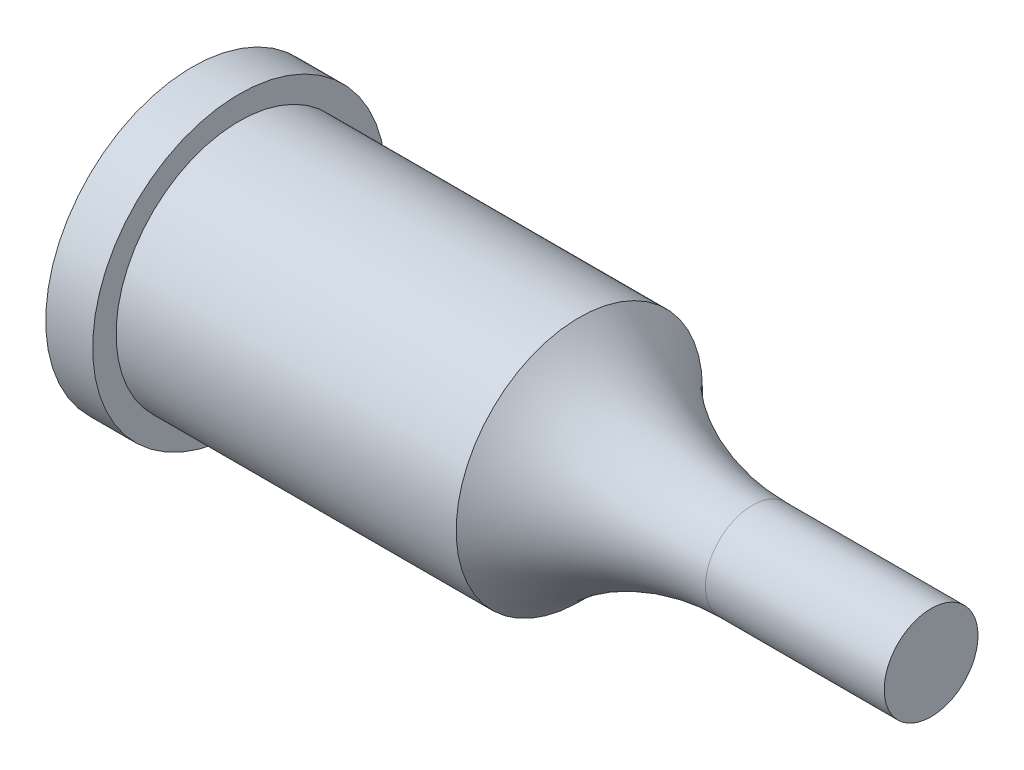
ISO-10303-21;
HEADER;
FILE_DESCRIPTION(('STEP AP214'),'2;1');
FILE_NAME('part.step','',(''),(''),'','','');
FILE_SCHEMA(('AUTOMOTIVE_DESIGN { 1 0 10303 214 1 1 1 1 }'));
ENDSEC;
DATA;
#1=APPLICATION_CONTEXT('core data for automotive mechanical design processes');
#2=APPLICATION_PROTOCOL_DEFINITION('international standard','automotive_design',2000,#1);
#3=PRODUCT_CONTEXT('',#1,'mechanical');
#4=PRODUCT('Part','Part','',(#3));
#5=PRODUCT_RELATED_PRODUCT_CATEGORY('part','',(#4));
#6=PRODUCT_DEFINITION_FORMATION('','',#4);
#7=PRODUCT_DEFINITION_CONTEXT('part definition',#1,'design');
#8=PRODUCT_DEFINITION('design','',#6,#7);
#9=PRODUCT_DEFINITION_SHAPE('','',#8);
#10=(LENGTH_UNIT() NAMED_UNIT(*) SI_UNIT(.MILLI.,.METRE.));
#11=(NAMED_UNIT(*) PLANE_ANGLE_UNIT() SI_UNIT($,.RADIAN.));
#12=(NAMED_UNIT(*) SI_UNIT($,.STERADIAN.) SOLID_ANGLE_UNIT());
#13=UNCERTAINTY_MEASURE_WITH_UNIT(LENGTH_MEASURE(1.E-05),#10,'distance_accuracy_value','');
#14=(GEOMETRIC_REPRESENTATION_CONTEXT(3) GLOBAL_UNCERTAINTY_ASSIGNED_CONTEXT((#13)) GLOBAL_UNIT_ASSIGNED_CONTEXT((#10,
#11,#12)) REPRESENTATION_CONTEXT('',''));
#15=CARTESIAN_POINT('',(0.,0.,0.));
#16=DIRECTION('',(0.,0.,1.));
#17=DIRECTION('',(1.,0.,0.));
#18=AXIS2_PLACEMENT_3D('',#15,#16,#17);
#19=CARTESIAN_POINT('',(9.34121621621611,0.,0.));
#20=DIRECTION('',(-1.,0.,0.));
#21=DIRECTION('',(0.,0.,1.));
#22=AXIS2_PLACEMENT_3D('',#19,#20,#21);
#23=PLANE('',#22);
#24=CARTESIAN_POINT('',(9.34121621621611,0.,3.3928571428572));
#25=DIRECTION('',(1.,0.,0.));
#26=DIRECTION('',(0.,0.,-1.));
#27=AXIS2_PLACEMENT_3D('',#24,#25,#26);
#28=CIRCLE('',#27,2.);
#29=CARTESIAN_POINT('',(9.34121621621611,0.,1.3928571428572));
#30=VERTEX_POINT('',#29);
#31=EDGE_CURVE('E40',#30,#30,#28,.T.);
#32=ORIENTED_EDGE('',*,*,#31,.T.);
#33=EDGE_LOOP('',(#32));
#34=FACE_BOUND('',#33,.T.);
#35=ADVANCED_FACE('F33',(#34),#23,.F.);
#36=CARTESIAN_POINT('',(9.34121621621611,0.,3.3928571428572));
#37=DIRECTION('',(1.,0.,0.));
#38=DIRECTION('',(0.,0.,-1.));
#39=AXIS2_PLACEMENT_3D('',#36,#37,#38);
#40=CYLINDRICAL_SURFACE('',#39,2.);
#41=CARTESIAN_POINT('',(1.71939349790297,0.,3.3928571428572));
#42=DIRECTION('',(-1.,0.,0.));
#43=DIRECTION('',(0.,0.,1.));
#44=AXIS2_PLACEMENT_3D('',#41,#42,#43);
#45=CIRCLE('',#44,2.);
#46=CARTESIAN_POINT('',(1.71939349790297,0.,5.3928571428572));
#47=VERTEX_POINT('',#46);
#48=EDGE_CURVE('E10',#47,#47,#45,.F.);
#49=ORIENTED_EDGE('',*,*,#48,.T.);
#50=EDGE_LOOP('',(#49));
#51=FACE_BOUND('',#50,.T.);
#52=ORIENTED_EDGE('',*,*,#31,.F.);
#53=EDGE_LOOP('',(#52));
#54=FACE_BOUND('',#53,.T.);
#55=ADVANCED_FACE('F74',(#51,#54),#40,.T.);
#56=CARTESIAN_POINT('',(9.34121621621611,0.,3.3928571428572));
#57=DIRECTION('',(1.,0.,0.));
#58=DIRECTION('',(0.,0.,-1.));
#59=AXIS2_PLACEMENT_3D('',#56,#57,#58);
#60=CYLINDRICAL_SURFACE('',#59,5.25);
#61=CARTESIAN_POINT('',(-5.65878378378388,0.,3.3928571428572));
#62=DIRECTION('',(1.,0.,0.));
#63=DIRECTION('',(0.,0.,-1.));
#64=AXIS2_PLACEMENT_3D('',#61,#62,#63);
#65=CIRCLE('',#64,5.25);
#66=CARTESIAN_POINT('',(-5.65878378378388,0.,-1.8571428571428));
#67=VERTEX_POINT('',#66);
#68=EDGE_CURVE('E44',#67,#67,#65,.T.);
#69=ORIENTED_EDGE('',*,*,#68,.F.);
#70=EDGE_LOOP('',(#69));
#71=FACE_BOUND('',#70,.T.);
#72=CARTESIAN_POINT('',(-20.1587837837839,0.,3.3928571428572));
#73=DIRECTION('',(1.,0.,0.));
#74=DIRECTION('',(0.,0.,-1.));
#75=AXIS2_PLACEMENT_3D('',#72,#73,#74);
#76=CIRCLE('',#75,5.25);
#77=CARTESIAN_POINT('',(-20.1587837837839,0.,-1.8571428571428));
#78=VERTEX_POINT('',#77);
#79=EDGE_CURVE('E48',#78,#78,#76,.T.);
#80=ORIENTED_EDGE('',*,*,#79,.T.);
#81=EDGE_LOOP('',(#80));
#82=FACE_BOUND('',#81,.T.);
#83=ADVANCED_FACE('F78',(#71,#82),#60,.T.);
#84=CARTESIAN_POINT('',(-20.1587837837839,0.,0.));
#85=DIRECTION('',(-1.,0.,0.));
#86=DIRECTION('',(0.,0.,1.));
#87=AXIS2_PLACEMENT_3D('',#84,#85,#86);
#88=PLANE('',#87);
#89=ORIENTED_EDGE('',*,*,#79,.F.);
#90=EDGE_LOOP('',(#89));
#91=FACE_BOUND('',#90,.T.);
#92=CARTESIAN_POINT('',(-20.1587837837839,0.,3.3928571428572));
#93=DIRECTION('',(1.,0.,0.));
#94=DIRECTION('',(0.,0.,-1.));
#95=AXIS2_PLACEMENT_3D('',#92,#93,#94);
#96=CIRCLE('',#95,6.25);
#97=CARTESIAN_POINT('',(-20.1587837837839,0.,-2.8571428571428));
#98=VERTEX_POINT('',#97);
#99=EDGE_CURVE('E53',#98,#98,#96,.T.);
#100=ORIENTED_EDGE('',*,*,#99,.T.);
#101=EDGE_LOOP('',(#100));
#102=FACE_BOUND('',#101,.T.);
#103=ADVANCED_FACE('F70',(#91,#102),#88,.F.);
#104=CARTESIAN_POINT('',(9.34121621621611,0.,3.3928571428572));
#105=DIRECTION('',(1.,0.,0.));
#106=DIRECTION('',(0.,0.,-1.));
#107=AXIS2_PLACEMENT_3D('',#104,#105,#106);
#108=CYLINDRICAL_SURFACE('',#107,6.25);
#109=ORIENTED_EDGE('',*,*,#99,.F.);
#110=EDGE_LOOP('',(#109));
#111=FACE_BOUND('',#110,.T.);
#112=CARTESIAN_POINT('',(-22.1587837837839,0.,3.3928571428572));
#113=DIRECTION('',(1.,0.,0.));
#114=DIRECTION('',(0.,0.,-1.));
#115=AXIS2_PLACEMENT_3D('',#112,#113,#114);
#116=CIRCLE('',#115,6.25);
#117=CARTESIAN_POINT('',(-22.1587837837839,0.,-2.8571428571428));
#118=VERTEX_POINT('',#117);
#119=EDGE_CURVE('E56',#118,#118,#116,.T.);
#120=ORIENTED_EDGE('',*,*,#119,.T.);
#121=EDGE_LOOP('',(#120));
#122=FACE_BOUND('',#121,.T.);
#123=ADVANCED_FACE('F60',(#111,#122),#108,.T.);
#124=CARTESIAN_POINT('',(-22.1587837837839,0.,0.));
#125=DIRECTION('',(-1.,0.,0.));
#126=DIRECTION('',(0.,0.,1.));
#127=AXIS2_PLACEMENT_3D('',#124,#125,#126);
#128=PLANE('',#127);
#129=ORIENTED_EDGE('',*,*,#119,.F.);
#130=EDGE_LOOP('',(#129));
#131=FACE_BOUND('',#130,.T.);
#132=ADVANCED_FACE('F62',(#131),#128,.T.);
#133=CARTESIAN_POINT('',(1.71939349790297,0.,3.3928571428572));
#134=DIRECTION('',(-1.,0.,0.));
#135=DIRECTION('',(0.,0.,1.));
#136=AXIS2_PLACEMENT_3D('',#133,#134,#135);
#137=TOROIDAL_SURFACE('',#136,12.,10.);
#138=ORIENTED_EDGE('',*,*,#68,.T.);
#139=EDGE_LOOP('',(#138));
#140=FACE_BOUND('',#139,.T.);
#141=ORIENTED_EDGE('',*,*,#48,.F.);
#142=EDGE_LOOP('',(#141));
#143=FACE_BOUND('',#142,.T.);
#144=ADVANCED_FACE('F35',(#140,#143),#137,.F.);
#145=CLOSED_SHELL('',(#35,#55,#83,#103,#123,#132,#144));
#146=MANIFOLD_SOLID_BREP('B2',#145);
#147=ADVANCED_BREP_SHAPE_REPRESENTATION('',(#18,#146),#14);
#148=SHAPE_DEFINITION_REPRESENTATION(#9,#147);
ENDSEC;
END-ISO-10303-21;
